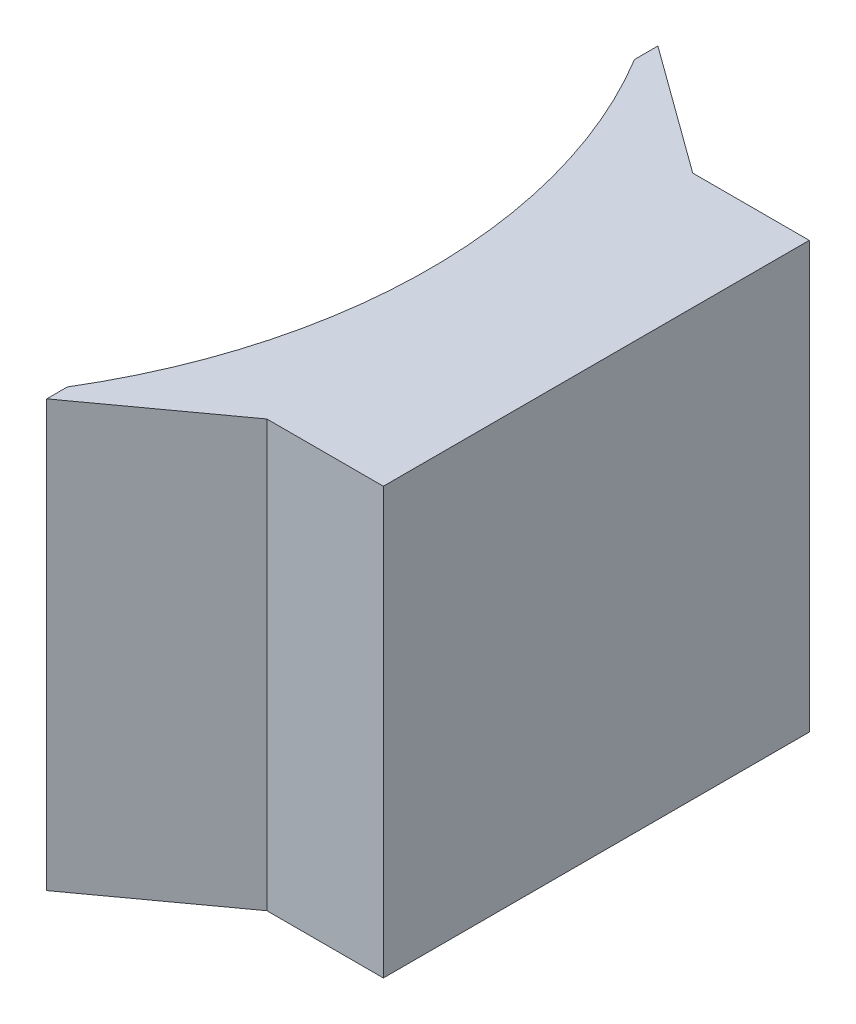
ISO-10303-21;
HEADER;
FILE_DESCRIPTION(('STEP AP214'),'2;1');
FILE_NAME('part.step','',(''),(''),'','','');
FILE_SCHEMA(('AUTOMOTIVE_DESIGN { 1 0 10303 214 1 1 1 1 }'));
ENDSEC;
DATA;
#1=APPLICATION_CONTEXT('core data for automotive mechanical design processes');
#2=APPLICATION_PROTOCOL_DEFINITION('international standard','automotive_design',2000,#1);
#3=PRODUCT_CONTEXT('',#1,'mechanical');
#4=PRODUCT('Part','Part','',(#3));
#5=PRODUCT_RELATED_PRODUCT_CATEGORY('part','',(#4));
#6=PRODUCT_DEFINITION_FORMATION('','',#4);
#7=PRODUCT_DEFINITION_CONTEXT('part definition',#1,'design');
#8=PRODUCT_DEFINITION('design','',#6,#7);
#9=PRODUCT_DEFINITION_SHAPE('','',#8);
#10=(LENGTH_UNIT() NAMED_UNIT(*) SI_UNIT(.MILLI.,.METRE.));
#11=(NAMED_UNIT(*) PLANE_ANGLE_UNIT() SI_UNIT($,.RADIAN.));
#12=(NAMED_UNIT(*) SI_UNIT($,.STERADIAN.) SOLID_ANGLE_UNIT());
#13=UNCERTAINTY_MEASURE_WITH_UNIT(LENGTH_MEASURE(1.E-05),#10,'distance_accuracy_value','');
#14=(GEOMETRIC_REPRESENTATION_CONTEXT(3) GLOBAL_UNCERTAINTY_ASSIGNED_CONTEXT((#13)) GLOBAL_UNIT_ASSIGNED_CONTEXT((#10,
#11,#12)) REPRESENTATION_CONTEXT('',''));
#15=CARTESIAN_POINT('',(0.,0.,0.));
#16=DIRECTION('',(0.,0.,1.));
#17=DIRECTION('',(1.,0.,0.));
#18=AXIS2_PLACEMENT_3D('',#15,#16,#17);
#19=CARTESIAN_POINT('',(-63.4579911763922,0.,258.104929331438));
#20=DIRECTION('',(-1.,0.,0.));
#21=DIRECTION('',(0.,0.,1.));
#22=AXIS2_PLACEMENT_3D('',#19,#20,#21);
#23=PLANE('',#22);
#24=DIRECTION('',(0.,1.,0.));
#25=VECTOR('',#24,1.);
#26=CARTESIAN_POINT('',(-63.4579911763922,-240.,247.850643876037));
#27=LINE('',#26,#25);
#28=CARTESIAN_POINT('',(-63.4579911763922,-212.,247.850643876037));
#29=VERTEX_POINT('',#28);
#30=CARTESIAN_POINT('',(-63.4579911763922,0.,247.850643876037));
#31=VERTEX_POINT('',#30);
#32=EDGE_CURVE('E11',#29,#31,#27,.T.);
#33=ORIENTED_EDGE('',*,*,#32,.F.);
#34=DIRECTION('',(0.,0.,-1.));
#35=VECTOR('',#34,1.);
#36=CARTESIAN_POINT('',(-63.4579911763922,-212.,258.104929331438));
#37=LINE('',#36,#35);
#38=CARTESIAN_POINT('',(-63.4579911763922,-212.,258.104929331438));
#39=VERTEX_POINT('',#38);
#40=EDGE_CURVE('E153',#39,#29,#37,.T.);
#41=ORIENTED_EDGE('',*,*,#40,.F.);
#42=DIRECTION('',(0.,-1.,0.));
#43=VECTOR('',#42,1.);
#44=CARTESIAN_POINT('',(-63.4579911763922,0.,258.104929331438));
#45=LINE('',#44,#43);
#46=CARTESIAN_POINT('',(-63.4579911763922,0.,258.104929331438));
#47=VERTEX_POINT('',#46);
#48=EDGE_CURVE('E165',#47,#39,#45,.T.);
#49=ORIENTED_EDGE('',*,*,#48,.F.);
#50=DIRECTION('',(0.,0.,-1.));
#51=VECTOR('',#50,1.);
#52=CARTESIAN_POINT('',(-63.4579911763922,0.,258.104929331438));
#53=LINE('',#52,#51);
#54=EDGE_CURVE('E168',#47,#31,#53,.T.);
#55=ORIENTED_EDGE('',*,*,#54,.T.);
#56=EDGE_LOOP('',(#33,#41,#49,#55));
#57=FACE_BOUND('',#56,.T.);
#58=ADVANCED_FACE('F35',(#57),#23,.T.);
#59=CARTESIAN_POINT('',(58.,0.,0.));
#60=DIRECTION('',(0.,0.,1.));
#61=DIRECTION('',(0.,-1.,0.));
#62=AXIS2_PLACEMENT_3D('',#59,#60,#61);
#63=PLANE('',#62);
#64=DIRECTION('',(0.,1.,0.));
#65=VECTOR('',#64,1.);
#66=CARTESIAN_POINT('',(0.,0.,0.));
#67=LINE('',#66,#65);
#68=CARTESIAN_POINT('',(0.,-212.,0.));
#69=VERTEX_POINT('',#68);
#70=CARTESIAN_POINT('',(0.,0.,0.));
#71=VERTEX_POINT('',#70);
#72=EDGE_CURVE('E126',#69,#71,#67,.T.);
#73=ORIENTED_EDGE('',*,*,#72,.T.);
#74=DIRECTION('',(-1.,0.,0.));
#75=VECTOR('',#74,1.);
#76=CARTESIAN_POINT('',(58.,0.,0.));
#77=LINE('',#76,#75);
#78=CARTESIAN_POINT('',(58.,0.,0.));
#79=VERTEX_POINT('',#78);
#80=EDGE_CURVE('E116',#79,#71,#77,.T.);
#81=ORIENTED_EDGE('',*,*,#80,.F.);
#82=DIRECTION('',(0.,1.,0.));
#83=VECTOR('',#82,1.);
#84=CARTESIAN_POINT('',(58.,0.,0.));
#85=LINE('',#84,#83);
#86=CARTESIAN_POINT('',(58.,-212.,0.));
#87=VERTEX_POINT('',#86);
#88=EDGE_CURVE('E107',#87,#79,#85,.T.);
#89=ORIENTED_EDGE('',*,*,#88,.F.);
#90=DIRECTION('',(-1.,0.,0.));
#91=VECTOR('',#90,1.);
#92=CARTESIAN_POINT('',(58.,-212.,0.));
#93=LINE('',#92,#91);
#94=EDGE_CURVE('E122',#87,#69,#93,.T.);
#95=ORIENTED_EDGE('',*,*,#94,.T.);
#96=EDGE_LOOP('',(#73,#81,#89,#95));
#97=FACE_BOUND('',#96,.T.);
#98=ADVANCED_FACE('F37',(#97),#63,.F.);
#99=CARTESIAN_POINT('',(58.,0.,0.));
#100=DIRECTION('',(0.,-1.,0.));
#101=DIRECTION('',(0.,0.,-1.));
#102=AXIS2_PLACEMENT_3D('',#99,#100,#101);
#103=PLANE('',#102);
#104=CARTESIAN_POINT('',(-63.4579911763921,0.,-34.4904578214462));
#105=VERTEX_POINT('',#104);
#106=CARTESIAN_POINT('',(-63.4579911763921,0.,-46.1049293314373));
#107=VERTEX_POINT('',#106);
#108=EDGE_CURVE('E170',#105,#107,#53,.T.);
#109=ORIENTED_EDGE('',*,*,#108,.F.);
#110=CARTESIAN_POINT('',(-297.40999256578,0.,106.680093027295));
#111=DIRECTION('',(0.,1.,0.));
#112=DIRECTION('',(0.,0.,1.));
#113=AXIS2_PLACEMENT_3D('',#110,#111,#112);
#114=CIRCLE('',#113,273.244695064767);
#115=EDGE_CURVE('E49',#31,#105,#114,.T.);
#116=ORIENTED_EDGE('',*,*,#115,.F.);
#117=ORIENTED_EDGE('',*,*,#54,.F.);
#118=DIRECTION('',(-0.809016994374947,0.,0.587785252292474));
#119=VECTOR('',#118,1.);
#120=CARTESIAN_POINT('',(0.,0.,212.));
#121=LINE('',#120,#119);
#122=CARTESIAN_POINT('',(0.,0.,212.));
#123=VERTEX_POINT('',#122);
#124=EDGE_CURVE('E71',#123,#47,#121,.T.);
#125=ORIENTED_EDGE('',*,*,#124,.F.);
#126=DIRECTION('',(-1.,0.,0.));
#127=VECTOR('',#126,1.);
#128=CARTESIAN_POINT('',(58.,0.,212.));
#129=LINE('',#128,#127);
#130=CARTESIAN_POINT('',(58.,0.,212.));
#131=VERTEX_POINT('',#130);
#132=EDGE_CURVE('E111',#131,#123,#129,.T.);
#133=ORIENTED_EDGE('',*,*,#132,.F.);
#134=DIRECTION('',(0.,0.,1.));
#135=VECTOR('',#134,1.);
#136=CARTESIAN_POINT('',(58.,0.,0.));
#137=LINE('',#136,#135);
#138=EDGE_CURVE('E101',#79,#131,#137,.T.);
#139=ORIENTED_EDGE('',*,*,#138,.F.);
#140=ORIENTED_EDGE('',*,*,#80,.T.);
#141=DIRECTION('',(0.809016994374951,0.,0.587785252292469));
#142=VECTOR('',#141,1.);
#143=CARTESIAN_POINT('',(-63.4579911763921,0.,-46.1049293314373));
#144=LINE('',#143,#142);
#145=EDGE_CURVE('E82',#107,#71,#144,.T.);
#146=ORIENTED_EDGE('',*,*,#145,.F.);
#147=EDGE_LOOP('',(#109,#116,#117,#125,#133,#139,#140,#146));
#148=FACE_BOUND('',#147,.T.);
#149=ADVANCED_FACE('F113',(#148),#103,.F.);
#150=CARTESIAN_POINT('',(58.,0.,212.));
#151=DIRECTION('',(0.,0.,-1.));
#152=DIRECTION('',(-1.,0.,0.));
#153=AXIS2_PLACEMENT_3D('',#150,#151,#152);
#154=PLANE('',#153);
#155=DIRECTION('',(0.,-1.,0.));
#156=VECTOR('',#155,1.);
#157=CARTESIAN_POINT('',(0.,0.,212.));
#158=LINE('',#157,#156);
#159=CARTESIAN_POINT('',(0.,-212.,212.));
#160=VERTEX_POINT('',#159);
#161=EDGE_CURVE('E129',#123,#160,#158,.T.);
#162=ORIENTED_EDGE('',*,*,#161,.T.);
#163=DIRECTION('',(-1.,0.,0.));
#164=VECTOR('',#163,1.);
#165=CARTESIAN_POINT('',(58.,-212.,212.));
#166=LINE('',#165,#164);
#167=CARTESIAN_POINT('',(58.,-212.,212.));
#168=VERTEX_POINT('',#167);
#169=EDGE_CURVE('E117',#168,#160,#166,.T.);
#170=ORIENTED_EDGE('',*,*,#169,.F.);
#171=DIRECTION('',(0.,-1.,0.));
#172=VECTOR('',#171,1.);
#173=CARTESIAN_POINT('',(58.,0.,212.));
#174=LINE('',#173,#172);
#175=EDGE_CURVE('E104',#131,#168,#174,.T.);
#176=ORIENTED_EDGE('',*,*,#175,.F.);
#177=ORIENTED_EDGE('',*,*,#132,.T.);
#178=EDGE_LOOP('',(#162,#170,#176,#177));
#179=FACE_BOUND('',#178,.T.);
#180=ADVANCED_FACE('F119',(#179),#154,.F.);
#181=CARTESIAN_POINT('',(58.,-212.,0.));
#182=DIRECTION('',(0.,1.,0.));
#183=DIRECTION('',(0.,0.,1.));
#184=AXIS2_PLACEMENT_3D('',#181,#182,#183);
#185=PLANE('',#184);
#186=ORIENTED_EDGE('',*,*,#40,.T.);
#187=CARTESIAN_POINT('',(-297.40999256578,-212.,106.680093027295));
#188=DIRECTION('',(0.,1.,0.));
#189=DIRECTION('',(0.,0.,1.));
#190=AXIS2_PLACEMENT_3D('',#187,#188,#189);
#191=CIRCLE('',#190,273.244695064767);
#192=CARTESIAN_POINT('',(-63.4579911763921,-212.,-34.4904578214462));
#193=VERTEX_POINT('',#192);
#194=EDGE_CURVE('E139',#29,#193,#191,.T.);
#195=ORIENTED_EDGE('',*,*,#194,.T.);
#196=CARTESIAN_POINT('',(-63.4579911763921,-212.,-46.1049293314373));
#197=VERTEX_POINT('',#196);
#198=EDGE_CURVE('E149',#193,#197,#37,.T.);
#199=ORIENTED_EDGE('',*,*,#198,.T.);
#200=DIRECTION('',(0.809016994374951,0.,0.587785252292469));
#201=VECTOR('',#200,1.);
#202=CARTESIAN_POINT('',(-63.4579911763921,-212.,-46.1049293314373));
#203=LINE('',#202,#201);
#204=EDGE_CURVE('E159',#197,#69,#203,.T.);
#205=ORIENTED_EDGE('',*,*,#204,.T.);
#206=ORIENTED_EDGE('',*,*,#94,.F.);
#207=DIRECTION('',(0.,0.,-1.));
#208=VECTOR('',#207,1.);
#209=CARTESIAN_POINT('',(58.,-212.,0.));
#210=LINE('',#209,#208);
#211=EDGE_CURVE('E58',#168,#87,#210,.T.);
#212=ORIENTED_EDGE('',*,*,#211,.F.);
#213=ORIENTED_EDGE('',*,*,#169,.T.);
#214=DIRECTION('',(-0.809016994374947,0.,0.587785252292474));
#215=VECTOR('',#214,1.);
#216=CARTESIAN_POINT('',(0.,-212.,212.));
#217=LINE('',#216,#215);
#218=EDGE_CURVE('E154',#160,#39,#217,.T.);
#219=ORIENTED_EDGE('',*,*,#218,.T.);
#220=EDGE_LOOP('',(#186,#195,#199,#205,#206,#212,#213,#219));
#221=FACE_BOUND('',#220,.T.);
#222=ADVANCED_FACE('F147',(#221),#185,.F.);
#223=CARTESIAN_POINT('',(58.,0.,0.));
#224=DIRECTION('',(-1.,0.,0.));
#225=DIRECTION('',(0.,0.,1.));
#226=AXIS2_PLACEMENT_3D('',#223,#224,#225);
#227=PLANE('',#226);
#228=ORIENTED_EDGE('',*,*,#88,.T.);
#229=ORIENTED_EDGE('',*,*,#138,.T.);
#230=ORIENTED_EDGE('',*,*,#175,.T.);
#231=ORIENTED_EDGE('',*,*,#211,.T.);
#232=EDGE_LOOP('',(#228,#229,#230,#231));
#233=FACE_BOUND('',#232,.T.);
#234=ADVANCED_FACE('F102',(#233),#227,.F.);
#235=CARTESIAN_POINT('',(0.,0.,212.));
#236=DIRECTION('',(0.587785252292474,0.,0.809016994374947));
#237=DIRECTION('',(0.809016994374947,0.,-0.587785252292474));
#238=AXIS2_PLACEMENT_3D('',#235,#236,#237);
#239=PLANE('',#238);
#240=ORIENTED_EDGE('',*,*,#218,.F.);
#241=ORIENTED_EDGE('',*,*,#161,.F.);
#242=ORIENTED_EDGE('',*,*,#124,.T.);
#243=ORIENTED_EDGE('',*,*,#48,.T.);
#244=EDGE_LOOP('',(#240,#241,#242,#243));
#245=FACE_BOUND('',#244,.T.);
#246=ADVANCED_FACE('F176',(#245),#239,.T.);
#247=CARTESIAN_POINT('',(-63.4579911763921,0.,-46.1049293314373));
#248=DIRECTION('',(0.587785252292469,0.,-0.809016994374951));
#249=DIRECTION('',(-0.809016994374951,0.,-0.587785252292469));
#250=AXIS2_PLACEMENT_3D('',#247,#248,#249);
#251=PLANE('',#250);
#252=ORIENTED_EDGE('',*,*,#204,.F.);
#253=DIRECTION('',(0.,-1.,0.));
#254=VECTOR('',#253,1.);
#255=CARTESIAN_POINT('',(-63.4579911763921,0.,-46.1049293314373));
#256=LINE('',#255,#254);
#257=EDGE_CURVE('E130',#107,#197,#256,.T.);
#258=ORIENTED_EDGE('',*,*,#257,.F.);
#259=ORIENTED_EDGE('',*,*,#145,.T.);
#260=ORIENTED_EDGE('',*,*,#72,.F.);
#261=EDGE_LOOP('',(#252,#258,#259,#260));
#262=FACE_BOUND('',#261,.T.);
#263=ADVANCED_FACE('F174',(#262),#251,.T.);
#264=DIRECTION('',(0.,1.,0.));
#265=VECTOR('',#264,1.);
#266=CARTESIAN_POINT('',(-63.4579911763921,-240.,-34.4904578214462));
#267=LINE('',#266,#265);
#268=EDGE_CURVE('E43',#105,#193,#267,.F.);
#269=ORIENTED_EDGE('',*,*,#268,.F.);
#270=ORIENTED_EDGE('',*,*,#108,.T.);
#271=ORIENTED_EDGE('',*,*,#257,.T.);
#272=ORIENTED_EDGE('',*,*,#198,.F.);
#273=EDGE_LOOP('',(#269,#270,#271,#272));
#274=FACE_BOUND('',#273,.T.);
#275=ADVANCED_FACE('F156',(#274),#23,.T.);
#276=CARTESIAN_POINT('',(-297.40999256578,-240.,106.680093027295));
#277=DIRECTION('',(0.,1.,0.));
#278=DIRECTION('',(0.,0.,1.));
#279=AXIS2_PLACEMENT_3D('',#276,#277,#278);
#280=CYLINDRICAL_SURFACE('',#279,273.244695064767);
#281=ORIENTED_EDGE('',*,*,#32,.T.);
#282=ORIENTED_EDGE('',*,*,#115,.T.);
#283=ORIENTED_EDGE('',*,*,#268,.T.);
#284=ORIENTED_EDGE('',*,*,#194,.F.);
#285=EDGE_LOOP('',(#281,#282,#283,#284));
#286=FACE_BOUND('',#285,.T.);
#287=ADVANCED_FACE('F138',(#286),#280,.F.);
#288=CLOSED_SHELL('',(#58,#98,#149,#180,#222,#234,#246,#263,#275,#287));
#289=MANIFOLD_SOLID_BREP('B2',#288);
#290=ADVANCED_BREP_SHAPE_REPRESENTATION('',(#18,#289),#14);
#291=SHAPE_DEFINITION_REPRESENTATION(#9,#290);
ENDSEC;
END-ISO-10303-21;
